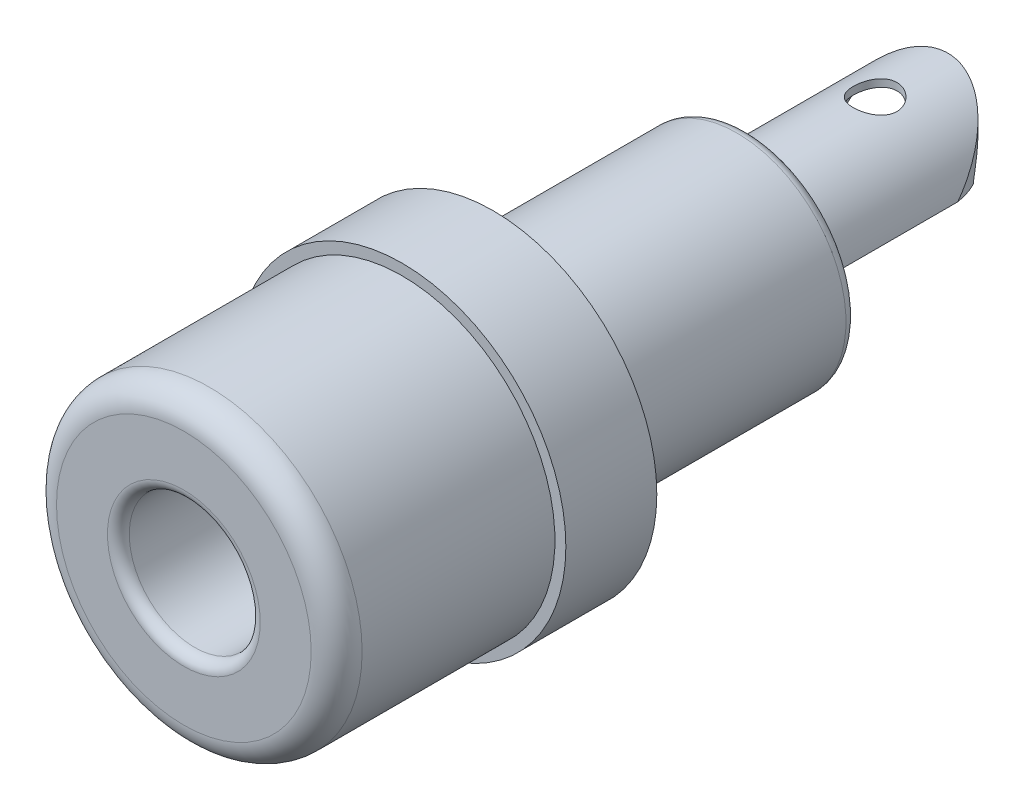
ISO-10303-21;
HEADER;
FILE_DESCRIPTION(('STEP AP214'),'2;1');
FILE_NAME('part.step','',(''),(''),'','','');
FILE_SCHEMA(('AUTOMOTIVE_DESIGN { 1 0 10303 214 1 1 1 1 }'));
ENDSEC;
DATA;
#1=APPLICATION_CONTEXT('core data for automotive mechanical design processes');
#2=APPLICATION_PROTOCOL_DEFINITION('international standard','automotive_design',2000,#1);
#3=PRODUCT_CONTEXT('',#1,'mechanical');
#4=PRODUCT('Part','Part','',(#3));
#5=PRODUCT_RELATED_PRODUCT_CATEGORY('part','',(#4));
#6=PRODUCT_DEFINITION_FORMATION('','',#4);
#7=PRODUCT_DEFINITION_CONTEXT('part definition',#1,'design');
#8=PRODUCT_DEFINITION('design','',#6,#7);
#9=PRODUCT_DEFINITION_SHAPE('','',#8);
#10=(LENGTH_UNIT() NAMED_UNIT(*) SI_UNIT(.MILLI.,.METRE.));
#11=(NAMED_UNIT(*) PLANE_ANGLE_UNIT() SI_UNIT($,.RADIAN.));
#12=(NAMED_UNIT(*) SI_UNIT($,.STERADIAN.) SOLID_ANGLE_UNIT());
#13=UNCERTAINTY_MEASURE_WITH_UNIT(LENGTH_MEASURE(1.E-05),#10,'distance_accuracy_value','');
#14=(GEOMETRIC_REPRESENTATION_CONTEXT(3) GLOBAL_UNCERTAINTY_ASSIGNED_CONTEXT((#13)) GLOBAL_UNIT_ASSIGNED_CONTEXT((#10,
#11,#12)) REPRESENTATION_CONTEXT('',''));
#15=CARTESIAN_POINT('',(0.,0.,0.));
#16=DIRECTION('',(0.,0.,1.));
#17=DIRECTION('',(1.,0.,0.));
#18=AXIS2_PLACEMENT_3D('',#15,#16,#17);
#19=CARTESIAN_POINT('',(0.,0.,6.));
#20=DIRECTION('',(0.,0.,-1.));
#21=DIRECTION('',(-1.,0.,0.));
#22=AXIS2_PLACEMENT_3D('',#19,#20,#21);
#23=CYLINDRICAL_SURFACE('',#22,1.8);
#24=CARTESIAN_POINT('',(0.,0.,5.7));
#25=DIRECTION('',(0.,0.,1.));
#26=DIRECTION('',(1.,0.,0.));
#27=AXIS2_PLACEMENT_3D('',#24,#25,#26);
#28=CIRCLE('',#27,1.8);
#29=CARTESIAN_POINT('',(1.8,0.,5.7));
#30=VERTEX_POINT('',#29);
#31=EDGE_CURVE('E41',#30,#30,#28,.T.);
#32=ORIENTED_EDGE('',*,*,#31,.T.);
#33=EDGE_LOOP('',(#32));
#34=FACE_BOUND('',#33,.T.);
#35=CARTESIAN_POINT('',(0.,1.8,-13.6007348706078));
#36=CARTESIAN_POINT('',(-0.0327380177320338,1.80000009180567,-13.6007350228468));
#37=CARTESIAN_POINT('',(-0.0654751167231297,1.79909861704529,-13.5980467109315));
#38=CARTESIAN_POINT('',(-0.129985056523783,1.79559126121966,-13.5873974053175));
#39=CARTESIAN_POINT('',(-0.161757796871289,1.79298520321283,-13.5794358642384));
#40=CARTESIAN_POINT('',(-0.223399673701066,1.78635184743874,-13.5585433245774));
#41=CARTESIAN_POINT('',(-0.253271895531622,1.78232692638544,-13.5456206331322));
#42=CARTESIAN_POINT('',(-0.310424962083192,1.77326667430373,-13.5152101669048));
#43=CARTESIAN_POINT('',(-0.337705294175215,1.76823114400547,-13.4977214916063));
#44=CARTESIAN_POINT('',(-0.389845005013366,1.75748456665927,-13.4580393876925));
#45=CARTESIAN_POINT('',(-0.414602220179014,1.75175733878739,-13.4357161300513));
#46=CARTESIAN_POINT('',(-0.46009961562122,1.74036188869405,-13.387274577784));
#47=CARTESIAN_POINT('',(-0.480838911293566,1.7346936797258,-13.3611554496514));
#48=CARTESIAN_POINT('',(-0.518294965336828,1.72387999488164,-13.3049438014891));
#49=CARTESIAN_POINT('',(-0.534878914933048,1.71875423572221,-13.2747586267656));
#50=CARTESIAN_POINT('',(-0.562691324326204,1.70985183244355,-13.2118292139356));
#51=CARTESIAN_POINT('',(-0.573921418430458,1.70607477671028,-13.179085760321));
#52=CARTESIAN_POINT('',(-0.590324076904995,1.70046781986259,-13.1131309377075));
#53=CARTESIAN_POINT('',(-0.595688068966016,1.69857657552103,-13.0799725454926));
#54=CARTESIAN_POINT('',(-0.600804674003908,1.69677394067485,-13.0131766180881));
#55=CARTESIAN_POINT('',(-0.60055902096291,1.696861938372,-12.9795392341713));
#56=CARTESIAN_POINT('',(-0.594611942221213,1.6989540898245,-12.9143728923435));
#57=CARTESIAN_POINT('',(-0.589160347899972,1.70087049514499,-12.8828178288569));
#58=CARTESIAN_POINT('',(-0.573363697709875,1.70625994640752,-12.8210988188431));
#59=CARTESIAN_POINT('',(-0.563018055955183,1.7097331787209,-12.7909350393466));
#60=CARTESIAN_POINT('',(-0.537563434836065,1.71790746677097,-12.7322872208531));
#61=CARTESIAN_POINT('',(-0.522380429224341,1.72262739475427,-12.7038380553261));
#62=CARTESIAN_POINT('',(-0.4877334637819,1.73275535145879,-12.6498123256399));
#63=CARTESIAN_POINT('',(-0.468268267418407,1.738163578744,-12.6242365944477));
#64=CARTESIAN_POINT('',(-0.424409599609338,1.74940397500517,-12.5752799117113));
#65=CARTESIAN_POINT('',(-0.399811890045786,1.75524353612871,-12.5520832539023));
#66=CARTESIAN_POINT('',(-0.34700374198204,1.76644163032256,-12.5100961106097));
#67=CARTESIAN_POINT('',(-0.318792957396489,1.7718001172285,-12.4913060477091));
#68=CARTESIAN_POINT('',(-0.25916856782776,1.78150264762667,-12.4585170904667));
#69=CARTESIAN_POINT('',(-0.227725965849802,1.78583610004821,-12.4445675758033));
#70=CARTESIAN_POINT('',(-0.162761450018705,1.79292340286663,-12.4222129662344));
#71=CARTESIAN_POINT('',(-0.129240262892973,1.79567780192928,-12.4138059453537));
#72=CARTESIAN_POINT('',(-0.0626302977175825,1.79920576242864,-12.4031014709944));
#73=CARTESIAN_POINT('',(-0.0295857599189076,1.80006001100238,-12.4005549851041));
#74=CARTESIAN_POINT('',(0.0364650419761412,1.79993341616895,-12.4009344747669));
#75=CARTESIAN_POINT('',(0.0694713115917873,1.79895288251611,-12.4038595265957));
#76=CARTESIAN_POINT('',(0.133511919782555,1.79532014830268,-12.4149020152494));
#77=CARTESIAN_POINT('',(0.164575684100913,1.79271719226737,-12.4228665942375));
#78=CARTESIAN_POINT('',(0.224913575147736,1.7861510809802,-12.4435709372878));
#79=CARTESIAN_POINT('',(0.254187473105135,1.78218775227925,-12.4563113102884));
#80=CARTESIAN_POINT('',(0.310972977835992,1.77317358772456,-12.4865771297123));
#81=CARTESIAN_POINT('',(0.338417975530396,1.76809688853783,-12.5042196265779));
#82=CARTESIAN_POINT('',(0.390038898081241,1.75743152349446,-12.5436513606156));
#83=CARTESIAN_POINT('',(0.414213820676935,1.75184270155133,-12.5654418642259));
#84=CARTESIAN_POINT('',(0.459751504684207,1.74046108789483,-12.6137221212127));
#85=CARTESIAN_POINT('',(0.480936581549093,1.73467056657093,-12.6403804067677));
#86=CARTESIAN_POINT('',(0.51855451339251,1.72379983972189,-12.6969978112905));
#87=CARTESIAN_POINT('',(0.534987328752505,1.71871964011872,-12.7269569577739));
#88=CARTESIAN_POINT('',(0.562558158254016,1.70989435092185,-12.7893386797917));
#89=CARTESIAN_POINT('',(0.573706879318659,1.70614656540379,-12.8217561181535));
#90=CARTESIAN_POINT('',(0.590336800075297,1.7004649943948,-12.8881620606823));
#91=CARTESIAN_POINT('',(0.595820552976746,1.69853039173619,-12.9221498498676));
#92=CARTESIAN_POINT('',(0.600765769482227,1.69678715325043,-12.9888531282157));
#93=CARTESIAN_POINT('',(0.600522154386556,1.69687440206579,-13.0215442747588));
#94=CARTESIAN_POINT('',(0.594745376072927,1.69890761954136,-13.0863939155476));
#95=CARTESIAN_POINT('',(0.589212527675332,1.70085347757531,-13.1185524413795));
#96=CARTESIAN_POINT('',(0.573223087876189,1.70630714567366,-13.1808162684154));
#97=CARTESIAN_POINT('',(0.562862007608928,1.70978458809308,-13.2109489656121));
#98=CARTESIAN_POINT('',(0.537587619456229,1.7178983929526,-13.2690713147691));
#99=CARTESIAN_POINT('',(0.522673301132388,1.72253501259178,-13.2970604893201));
#100=CARTESIAN_POINT('',(0.487956415549949,1.73269697534436,-13.351425072562));
#101=CARTESIAN_POINT('',(0.467968945658719,1.73825226984962,-13.3776767717469));
#102=CARTESIAN_POINT('',(0.423985729881418,1.74950013770272,-13.4265487586382));
#103=CARTESIAN_POINT('',(0.399988850670897,1.75519274947511,-13.4491680160206));
#104=CARTESIAN_POINT('',(0.347544934152404,1.76634018315236,-13.4910215179813));
#105=CARTESIAN_POINT('',(0.318960908099835,1.7717770908073,-13.5100894792584));
#106=CARTESIAN_POINT('',(0.258814414443977,1.78155594703591,-13.5431291279182));
#107=CARTESIAN_POINT('',(0.227252710879409,1.78589817544764,-13.557102118161));
#108=CARTESIAN_POINT('',(0.163496188320585,1.79283309041119,-13.578967850101));
#109=CARTESIAN_POINT('',(0.131392654605845,1.79549527453512,-13.5871043503658));
#110=CARTESIAN_POINT('',(0.0661922496061482,1.79907844238535,-13.5979870390141));
#111=CARTESIAN_POINT('',(0.0330956553412479,1.79999990719143,-13.6007347167057));
#112=CARTESIAN_POINT('',(0.,1.8,-13.6007348706078));
#113=B_SPLINE_CURVE_WITH_KNOTS('',3,(#35,#36,#37,#38,#39,#40,#41,#42,#43,#44,#45,#46,#47,#48,
#49,#50,#51,#52,#53,#54,#55,#56,#57,#58,#59,#60,#61,#62,#63,#64,#65,#66,#67,#68,#69,#70,#71,#72,
#73,#74,#75,#76,#77,#78,#79,#80,#81,#82,#83,#84,#85,#86,#87,#88,#89,#90,#91,#92,#93,#94,#95,#96,
#97,#98,#99,#100,#101,#102,#103,#104,#105,#106,#107,#108,#109,#110,#111,#112),.UNSPECIFIED.,.T.,
.F.,(4,2,2,2,2,2,2,2,2,2,2,2,2,2,2,2,2,2,2,2,2,2,2,2,2,2,2,2,2,2,2,2,2,2,2,2,2,2,4),(0.,
0.0980922636156061,0.196194711160512,0.294133603722163,0.392091826679459,0.493108105696535,
0.59414659972518,0.698090308940824,0.802002268156999,0.902411554425504,1.00278980387301,
1.09858095925578,1.19438358508099,1.29172902687889,1.38910261529734,1.4915598348163,
1.59402687574781,1.69751043385025,1.80095801321135,1.89992149899912,1.99886827893316,
2.09494894781738,2.19104187165272,2.28966239901052,2.38831308487945,2.49144613723261,
2.59458004935808,2.6975040828946,2.80038170815317,2.89797399628781,2.99556047599521,
3.09129352236946,3.18704782894283,3.28698040003779,3.38694126662963,3.49079796489756,
3.5946280868017,3.69381935012984,3.7929831961158),.UNSPECIFIED.);
#114=CARTESIAN_POINT('',(0.,1.8,-13.6007348706078));
#115=VERTEX_POINT('',#114);
#116=EDGE_CURVE('E121',#115,#115,#113,.T.);
#117=ORIENTED_EDGE('',*,*,#116,.T.);
#118=EDGE_LOOP('',(#117));
#119=FACE_BOUND('',#118,.T.);
#120=DIRECTION('',(0.,0.,1.));
#121=VECTOR('',#120,1.);
#122=CARTESIAN_POINT('',(-1.77482393492988,0.3,-40.3046486500062));
#123=LINE('',#122,#121);
#124=CARTESIAN_POINT('',(-1.77482393492988,0.299999999999998,-13.9210940709223));
#125=VERTEX_POINT('',#124);
#126=CARTESIAN_POINT('',(-1.77482393492988,0.3,-9.5));
#127=VERTEX_POINT('',#126);
#128=EDGE_CURVE('E92',#125,#127,#123,.T.);
#129=ORIENTED_EDGE('',*,*,#128,.F.);
#130=CARTESIAN_POINT('',(-1.8,0.,-13.8708274275255));
#131=CARTESIAN_POINT('',(-1.80000540923821,0.0273212835889739,-13.8708046515745));
#132=CARTESIAN_POINT('',(-1.79937773064341,0.0546182889958019,-13.8721154858209));
#133=CARTESIAN_POINT('',(-1.79690877179539,0.108854711485443,-13.8772008154702));
#134=CARTESIAN_POINT('',(-1.79507077819749,0.135794895985899,-13.8809686385602));
#135=CARTESIAN_POINT('',(-1.78790475520837,0.214845245646857,-13.8954824661366));
#136=CARTESIAN_POINT('',(-1.78092030388619,0.266219131823027,-13.9094543854984));
#137=CARTESIAN_POINT('',(-1.75872274013309,0.390725371269543,-13.9519195362688));
#138=CARTESIAN_POINT('',(-1.7411493276756,0.462073713965778,-13.9841765357544));
#139=CARTESIAN_POINT('',(-1.69874521910181,0.599588329947943,-14.0557657390422));
#140=CARTESIAN_POINT('',(-1.67383505602685,0.665687228778102,-14.0951734995342));
#141=CARTESIAN_POINT('',(-1.62151254890367,0.783723503020899,-14.1710208864447));
#142=CARTESIAN_POINT('',(-1.59499154911741,0.836322090169787,-14.2070581717374));
#143=CARTESIAN_POINT('',(-1.53720866191813,0.938310784460617,-14.2798825665153));
#144=CARTESIAN_POINT('',(-1.5059438359789,0.987698875609969,-14.316670128442));
#145=CARTESIAN_POINT('',(-1.40521265571992,1.13092236798577,-14.426298860448));
#146=CARTESIAN_POINT('',(-1.32860369837563,1.22027829571291,-14.4987244765749));
#147=CARTESIAN_POINT('',(-1.17681137326886,1.36501569800337,-14.6191259314979));
#148=CARTESIAN_POINT('',(-1.1057779172675,1.42338376677199,-14.6687745882009));
#149=CARTESIAN_POINT('',(-0.952407933008528,1.53023622824735,-14.7608309924895));
#150=CARTESIAN_POINT('',(-0.870087075158914,1.57873409590929,-14.8032485989894));
#151=CARTESIAN_POINT('',(-0.712151901768292,1.65497642563914,-14.8704288928505));
#152=CARTESIAN_POINT('',(-0.638388108483012,1.68492563549023,-14.8970225322606));
#153=CARTESIAN_POINT('',(-0.48522778528316,1.73523332905439,-14.9418593023828));
#154=CARTESIAN_POINT('',(-0.405834996655984,1.75559811551519,-14.9601079205834));
#155=CARTESIAN_POINT('',(-0.242887864108498,1.78546935266674,-14.9869166665395));
#156=CARTESIAN_POINT('',(-0.159311368566592,1.79490978027358,-14.9954178815297));
#157=CARTESIAN_POINT('',(0.00873761011171364,1.80193988970709,-15.0017460145548));
#158=CARTESIAN_POINT('',(0.0932097967957123,1.79953337750131,-14.999576360731));
#159=CARTESIAN_POINT('',(0.251893967541528,1.78389613132067,-14.9855111976086));
#160=CARTESIAN_POINT('',(0.326304452543621,1.77174154921254,-14.9745827093039));
#161=CARTESIAN_POINT('',(0.471551651141702,1.73873215661482,-14.9450077383162));
#162=CARTESIAN_POINT('',(0.54238757816978,1.71787544053079,-14.9263595651826));
#163=CARTESIAN_POINT('',(0.682910213844337,1.66718907043137,-14.8812769536451));
#164=CARTESIAN_POINT('',(0.752320129264993,1.63692951408235,-14.8544711259141));
#165=CARTESIAN_POINT('',(0.884815246712993,1.56928129758766,-14.7950161587097));
#166=CARTESIAN_POINT('',(0.947898432427714,1.53189037564087,-14.7623651655717));
#167=CARTESIAN_POINT('',(1.09884875915407,1.42991083696128,-14.6742741574571));
#168=CARTESIAN_POINT('',(1.18231688882613,1.3613560851102,-14.6158757973679));
#169=CARTESIAN_POINT('',(1.3340171856506,1.21314644697905,-14.4930538651354));
#170=CARTESIAN_POINT('',(1.40218870286604,1.13344933940626,-14.4286076968813));
#171=CARTESIAN_POINT('',(1.49384683396911,1.00560940048153,-14.3302323305205));
#172=CARTESIAN_POINT('',(1.52291704087311,0.961022066100188,-14.2967405271588));
#173=CARTESIAN_POINT('',(1.57712212314051,0.869212121970928,-14.23019974892));
#174=CARTESIAN_POINT('',(1.6022585838982,0.821990584332634,-14.1971506005783));
#175=CARTESIAN_POINT('',(1.64849531001723,0.724812289669821,-14.1325896082659));
#176=CARTESIAN_POINT('',(1.66960625173658,0.674863232761343,-14.1010738677859));
#177=CARTESIAN_POINT('',(1.70766662863583,0.57174332074305,-14.0410201136218));
#178=CARTESIAN_POINT('',(1.72462238093073,0.518577511439559,-14.0124776181929));
#179=CARTESIAN_POINT('',(1.75227734228499,0.414809375330063,-13.963688084292));
#180=CARTESIAN_POINT('',(1.76347253075727,0.364618316639512,-13.942864017903));
#181=CARTESIAN_POINT('',(1.78168196381915,0.26138481756263,-13.9079633842278));
#182=CARTESIAN_POINT('',(1.7887205867006,0.208361032931755,-13.8938475703145));
#183=CARTESIAN_POINT('',(1.79555291088374,0.128992257415699,-13.8799818367588));
#184=CARTESIAN_POINT('',(1.79720907313568,0.103428270666778,-13.8765836690024));
#185=CARTESIAN_POINT('',(1.79943765407354,0.0519177083159683,-13.8719912511546));
#186=CARTESIAN_POINT('',(1.80000411576696,0.0259698067873122,-13.8708091161918));
#187=CARTESIAN_POINT('',(1.8,0.,-13.8708274275255));
#188=B_SPLINE_CURVE_WITH_KNOTS('',3,(#130,#131,#132,#133,#134,#135,#136,#137,#138,#139,#140,
#141,#142,#143,#144,#145,#146,#147,#148,#149,#150,#151,#152,#153,#154,#155,#156,#157,#158,#159,
#160,#161,#162,#163,#164,#165,#166,#167,#168,#169,#170,#171,#172,#173,#174,#175,#176,#177,#178,
#179,#180,#181,#182,#183,#184,#185,#186,#187),.UNSPECIFIED.,.F.,.F.,(4,2,2,2,2,2,2,2,2,2,2,2,2,
2,2,2,2,2,2,2,2,2,2,2,2,2,2,2,4),(0.,0.0818841494021474,0.163546851289647,0.323824679561786,
0.563255515992799,0.805381577202844,1.01228021967863,1.21930755111762,1.63159055833515,
1.94400425203985,2.25598852944884,2.50679257630735,2.7574314623672,3.00957734068643,
3.26164221948919,3.48917734766555,3.71676232768651,3.95684684506776,4.1970076352422,
4.56338762599947,4.9311955793092,5.11971555990609,5.30815936565666,5.49609621494709,
5.68374554707032,5.8497580095361,6.0147868804176,6.09220322189024,6.1700415806469),.UNSPECIFIED.);
#189=CARTESIAN_POINT('',(1.77482393492988,0.3,-13.9210940709223));
#190=VERTEX_POINT('',#189);
#191=EDGE_CURVE('E48',#125,#190,#188,.T.);
#192=ORIENTED_EDGE('',*,*,#191,.T.);
#193=DIRECTION('',(0.,0.,1.));
#194=VECTOR('',#193,1.);
#195=CARTESIAN_POINT('',(1.77482393492988,0.3,-40.3046486500062));
#196=LINE('',#195,#194);
#197=CARTESIAN_POINT('',(1.77482393492988,0.3,-9.5));
#198=VERTEX_POINT('',#197);
#199=EDGE_CURVE('E84',#190,#198,#196,.T.);
#200=ORIENTED_EDGE('',*,*,#199,.T.);
#201=CARTESIAN_POINT('',(0.,0.,-9.5));
#202=DIRECTION('',(0.,0.,-1.));
#203=DIRECTION('',(-1.,0.,0.));
#204=AXIS2_PLACEMENT_3D('',#201,#202,#203);
#205=CIRCLE('',#204,1.8);
#206=EDGE_CURVE('E104',#198,#127,#205,.T.);
#207=ORIENTED_EDGE('',*,*,#206,.T.);
#208=EDGE_LOOP('',(#129,#192,#200,#207));
#209=FACE_BOUND('',#208,.T.);
#210=ADVANCED_FACE('F33',(#34,#119,#209),#23,.F.);
#211=CARTESIAN_POINT('',(0.,0.,-40.3046486500062));
#212=DIRECTION('',(0.,0.,1.));
#213=DIRECTION('',(1.,0.,0.));
#214=AXIS2_PLACEMENT_3D('',#211,#212,#213);
#215=CYLINDRICAL_SURFACE('',#214,2.);
#216=CARTESIAN_POINT('',(0.,2.,-13.6007348706078));
#217=CARTESIAN_POINT('',(-0.0329154451013199,1.99999971700221,-13.6007344716138));
#218=CARTESIAN_POINT('',(-0.0658349273406117,1.99917966277583,-13.5980173251582));
#219=CARTESIAN_POINT('',(-0.130715250121952,1.99598842237475,-13.5872463289189));
#220=CARTESIAN_POINT('',(-0.162675801764567,1.99361677355871,-13.5791908873985));
#221=CARTESIAN_POINT('',(-0.22469308310181,1.9875822100074,-13.5580364638437));
#222=CARTESIAN_POINT('',(-0.25475254575815,1.98392120100191,-13.5449449227602));
#223=CARTESIAN_POINT('',(-0.312249672421251,1.97568843695037,-13.5141204333855));
#224=CARTESIAN_POINT('',(-0.339686986987863,1.97111656076748,-13.4963868676496));
#225=CARTESIAN_POINT('',(-0.391948718873501,1.9614029487719,-13.4562452676187));
#226=CARTESIAN_POINT('',(-0.416687228497751,1.9562495346312,-13.4337282202533));
#227=CARTESIAN_POINT('',(-0.462099683693278,1.94602333683871,-13.3848911786438));
#228=CARTESIAN_POINT('',(-0.482772945309703,1.94095056688659,-13.3585705457582));
#229=CARTESIAN_POINT('',(-0.51992015089489,1.93133645598676,-13.3021465693923));
#230=CARTESIAN_POINT('',(-0.53628923608908,1.92680962669952,-13.2719714862099));
#231=CARTESIAN_POINT('',(-0.563685579098815,1.91897448153211,-13.2091391689173));
#232=CARTESIAN_POINT('',(-0.574714119679047,1.91566587308889,-13.1764825330427));
#233=CARTESIAN_POINT('',(-0.590806534730252,1.91076348351385,-13.1105787641545));
#234=CARTESIAN_POINT('',(-0.596028784940188,1.90912427788711,-13.0773737730504));
#235=CARTESIAN_POINT('',(-0.600854922460317,1.90761115958514,-13.0105216081067));
#236=CARTESIAN_POINT('',(-0.600460171044287,1.90773681919679,-12.976874543378));
#237=CARTESIAN_POINT('',(-0.594187908798803,1.90969897612233,-12.9113813071654));
#238=CARTESIAN_POINT('',(-0.588508821050622,1.91147355435668,-12.8795139704632));
#239=CARTESIAN_POINT('',(-0.572149681708342,1.91643342495439,-12.8172069560981));
#240=CARTESIAN_POINT('',(-0.561469136566595,1.91961885654016,-12.786767419658));
#241=CARTESIAN_POINT('',(-0.535264106614693,1.92709093228899,-12.7276947307436));
#242=CARTESIAN_POINT('',(-0.519675267738561,1.93139206446088,-12.6990920370257));
#243=CARTESIAN_POINT('',(-0.484140890354741,1.94060394800318,-12.6448420618037));
#244=CARTESIAN_POINT('',(-0.464194296010355,1.94551484698876,-12.6191954988423));
#245=CARTESIAN_POINT('',(-0.419525163062182,1.95564404519092,-12.570460394303));
#246=CARTESIAN_POINT('',(-0.394637962986787,1.96086661724177,-12.5475234049959));
#247=CARTESIAN_POINT('',(-0.341305303725586,1.97084897625326,-12.5061132769821));
#248=CARTESIAN_POINT('',(-0.312859620744354,1.9756087340737,-12.487640419242));
#249=CARTESIAN_POINT('',(-0.252942015337119,1.98417264027782,-12.4555909016219));
#250=CARTESIAN_POINT('',(-0.221451099899179,1.98797017467324,-12.4420478641078));
#251=CARTESIAN_POINT('',(-0.156498166241407,1.9941340873289,-12.4204950345679));
#252=CARTESIAN_POINT('',(-0.123036700635833,1.996500864748,-12.4124836991948));
#253=CARTESIAN_POINT('',(-0.056380897067333,1.99947345857415,-12.402473999448));
#254=CARTESIAN_POINT('',(-0.0232200390404748,2.00013940167117,-12.4002702362871));
#255=CARTESIAN_POINT('',(0.0429998423293526,1.99981169296703,-12.4013625328926));
#256=CARTESIAN_POINT('',(0.0760588786763107,1.99881826271098,-12.4046578584684));
#257=CARTESIAN_POINT('',(0.14036144212388,1.99532278794869,-12.4164887150524));
#258=CARTESIAN_POINT('',(0.171629109045672,1.99285531919782,-12.4249042256401));
#259=CARTESIAN_POINT('',(0.232301855581804,1.98669739136598,-12.4465921637191));
#260=CARTESIAN_POINT('',(0.261706710810216,1.98300678528377,-12.4598651750229));
#261=CARTESIAN_POINT('',(0.318574875784436,1.97467861740588,-12.4912361368003));
#262=CARTESIAN_POINT('',(0.34597753047993,1.97002112332088,-12.5094386069871));
#263=CARTESIAN_POINT('',(0.397409323191995,1.96029387505509,-12.5500247722287));
#264=CARTESIAN_POINT('',(0.421437612942136,1.95522401771617,-12.5724095153622));
#265=CARTESIAN_POINT('',(0.466342978204351,1.94501268748499,-12.6216897939562));
#266=CARTESIAN_POINT('',(0.487073924926942,1.93987530016511,-12.6487196209189));
#267=CARTESIAN_POINT('',(0.523715980287685,1.93030606092181,-12.7059860462107));
#268=CARTESIAN_POINT('',(0.539627215314416,1.92587419049889,-12.7362225604219));
#269=CARTESIAN_POINT('',(0.566069388510893,1.91826875857973,-12.7989478671159));
#270=CARTESIAN_POINT('',(0.576625387759088,1.91508935181965,-12.8314253452504));
#271=CARTESIAN_POINT('',(0.592086923271644,1.91036637789379,-12.89781005821));
#272=CARTESIAN_POINT('',(0.596994395917994,1.90882225014947,-12.9317167989323));
#273=CARTESIAN_POINT('',(0.600887937937676,1.90759988987286,-12.9984794779526));
#274=CARTESIAN_POINT('',(0.600112221233274,1.90784658974116,-13.0313203310133));
#275=CARTESIAN_POINT('',(0.593230021779939,1.90999760518303,-13.0963805119584));
#276=CARTESIAN_POINT('',(0.587123752499047,1.91190185437816,-13.1285998646787));
#277=CARTESIAN_POINT('',(0.569907555216364,1.91710305467369,-13.1911130302645));
#278=CARTESIAN_POINT('',(0.558860702028225,1.92038241818175,-13.2214257855524));
#279=CARTESIAN_POINT('',(0.532126028484566,1.92796111563865,-13.279791846135));
#280=CARTESIAN_POINT('',(0.516437319851519,1.93226064477782,-13.3078447176641));
#281=CARTESIAN_POINT('',(0.480195055220275,1.94159070570274,-13.3620001172186));
#282=CARTESIAN_POINT('',(0.459485104371972,1.94664216065503,-13.3879943751119));
#283=CARTESIAN_POINT('',(0.414069738519131,1.95680528180026,-13.4362158699309));
#284=CARTESIAN_POINT('',(0.389363286853801,1.96191696329566,-13.4584421263949));
#285=CARTESIAN_POINT('',(0.335786304873297,1.97180374628255,-13.4991442355258));
#286=CARTESIAN_POINT('',(0.306815154316242,1.97656463906268,-13.51749144935));
#287=CARTESIAN_POINT('',(0.246056549593411,1.98504272182326,-13.5490289385694));
#288=CARTESIAN_POINT('',(0.214270421199581,1.98876039972427,-13.5622216259176));
#289=CARTESIAN_POINT('',(0.152303085062112,1.9944086998772,-13.5818929808689));
#290=CARTESIAN_POINT('',(0.122314784781694,1.99648810952427,-13.5889395397611));
#291=CARTESIAN_POINT('',(0.0615520780923121,1.99928377797797,-13.5983602807044));
#292=CARTESIAN_POINT('',(0.030777803943256,2.00000026461896,-13.6007352436897));
#293=CARTESIAN_POINT('',(0.,2.,-13.6007348706078));
#294=B_SPLINE_CURVE_WITH_KNOTS('',3,(#216,#217,#218,#219,#220,#221,#222,#223,#224,#225,#226,
#227,#228,#229,#230,#231,#232,#233,#234,#235,#236,#237,#238,#239,#240,#241,#242,#243,#244,#245,
#246,#247,#248,#249,#250,#251,#252,#253,#254,#255,#256,#257,#258,#259,#260,#261,#262,#263,#264,
#265,#266,#267,#268,#269,#270,#271,#272,#273,#274,#275,#276,#277,#278,#279,#280,#281,#282,#283,
#284,#285,#286,#287,#288,#289,#290,#291,#292,#293),.UNSPECIFIED.,.T.,.F.,(4,2,2,2,2,2,2,2,2,2,2,
2,2,2,2,2,2,2,2,2,2,2,2,2,2,2,2,2,2,2,2,2,2,2,2,2,2,2,4),(0.,0.0986332814450439,
0.197295985938399,0.295813470520349,0.39434406576508,0.495422411792764,0.59651774915453,
0.699885924016437,0.803229258172892,0.903678757411505,1.00410391324614,1.10090406676049,
1.19771377460179,1.29584970575826,1.39400944060401,1.49626841616245,1.59853382609407,
1.70148418749654,1.80440581408501,1.90363523772396,2.00285141417109,2.09982698669909,
2.1968142183447,2.29604522278142,2.39530112797055,2.49816160126106,2.60101937698051,
2.7033912597652,2.80572803779072,2.90380062181736,3.00186927859599,3.09872016156048,
3.19558959016202,3.29598770266931,3.3964118995396,3.49977198457628,3.60308364633053,
3.69532676767143,3.78755446774509),.UNSPECIFIED.);
#295=CARTESIAN_POINT('',(0.,2.,-13.6007348706078));
#296=VERTEX_POINT('',#295);
#297=EDGE_CURVE('E80',#296,#296,#294,.T.);
#298=ORIENTED_EDGE('',*,*,#297,.F.);
#299=EDGE_LOOP('',(#298));
#300=FACE_BOUND('',#299,.T.);
#301=CARTESIAN_POINT('',(-1.99926512939221,0.0542120133950132,-13.0007348706078));
#302=CARTESIAN_POINT('',(-1.99926544229567,0.0541892752252256,-13.0045705003581));
#303=CARTESIAN_POINT('',(-1.99925414443223,0.0546179890129462,-13.0083667297564));
#304=CARTESIAN_POINT('',(-1.99921207426811,0.0561424826539032,-13.015733887174));
#305=CARTESIAN_POINT('',(-1.99918177584472,0.0572220065585727,-13.0193080357622));
#306=CARTESIAN_POINT('',(-1.99905779304332,0.0614451759181349,-13.0305790637227));
#307=CARTESIAN_POINT('',(-1.99893205108814,0.0654908554195775,-13.0379111464521));
#308=CARTESIAN_POINT('',(-1.99861711317244,0.0745118522539095,-13.0521299982837));
#309=CARTESIAN_POINT('',(-1.99842654790211,0.0795061062210708,-13.0590029654449));
#310=CARTESIAN_POINT('',(-1.99723172576251,0.107601531872094,-13.0958423146994));
#311=CARTESIAN_POINT('',(-1.99569213131996,0.133606957336773,-13.1234962344913));
#312=CARTESIAN_POINT('',(-1.99155664959128,0.185526806812603,-13.1781270876444));
#313=CARTESIAN_POINT('',(-1.98897061838641,0.21143986412281,-13.2051079098726));
#314=CARTESIAN_POINT('',(-1.97957236361627,0.289883111657074,-13.285949946783));
#315=CARTESIAN_POINT('',(-1.97113327640812,0.342770880677535,-13.3393386580281));
#316=CARTESIAN_POINT('',(-1.94988588670936,0.448183454890475,-13.4456187513169));
#317=CARTESIAN_POINT('',(-1.93707493218384,0.500708019980446,-13.4985098114198));
#318=CARTESIAN_POINT('',(-1.90693331075533,0.605456792409913,-13.6037982377075));
#319=CARTESIAN_POINT('',(-1.88958306463922,0.657678671585724,-13.6561924206078));
#320=CARTESIAN_POINT('',(-1.85028582702617,0.761257790887164,-13.7600652618009));
#321=CARTESIAN_POINT('',(-1.82833964008914,0.812615180651434,-13.8115440786276));
#322=CARTESIAN_POINT('',(-1.75523874932515,0.965357104978325,-13.9645937787004));
#323=CARTESIAN_POINT('',(-1.6969021664684,1.0651235348985,-14.064489081262));
#324=CARTESIAN_POINT('',(-1.55981747921933,1.257327157592,-14.2568990776492));
#325=CARTESIAN_POINT('',(-1.48110906441173,1.34977815043483,-14.3494276704039));
#326=CARTESIAN_POINT('',(-1.32468777751634,1.5012783096384,-14.5010361999037));
#327=CARTESIAN_POINT('',(-1.25185050450801,1.56282928988267,-14.5626248482409));
#328=CARTESIAN_POINT('',(-1.09363993020102,1.67733655152659,-14.6771961568561));
#329=CARTESIAN_POINT('',(-1.00828128036743,1.73030272771215,-14.7301887249751));
#330=CARTESIAN_POINT('',(-0.84281150342767,1.81565785513585,-14.8155835923759));
#331=CARTESIAN_POINT('',(-0.764774331158803,1.8500442188765,-14.849984828585));
#332=CARTESIAN_POINT('',(-0.601726145177751,1.90930099941634,-14.9092662661246));
#333=CARTESIAN_POINT('',(-0.516719712725512,1.93417760752301,-14.9341526620745));
#334=CARTESIAN_POINT('',(-0.340994281035888,1.9727811844718,-14.9727711158483));
#335=CARTESIAN_POINT('',(-0.25023698195819,1.98642251506602,-14.986417499373));
#336=CARTESIAN_POINT('',(-0.0667057154365254,2.00100113286654,-15.0010015112697));
#337=CARTESIAN_POINT('',(0.02606700724611,2.00194605004895,-15.0019467724476));
#338=CARTESIAN_POINT('',(0.198716901916874,1.99174836280759,-14.9917453193297));
#339=CARTESIAN_POINT('',(0.278777778588639,1.98207690027572,-14.9820702890579));
#340=CARTESIAN_POINT('',(0.435563980591769,1.95362073188233,-14.9536033210733));
#341=CARTESIAN_POINT('',(0.512288849726159,1.93483478386466,-14.9348101407049));
#342=CARTESIAN_POINT('',(0.662958597860155,1.88861901524004,-14.8885757668672));
#343=CARTESIAN_POINT('',(0.736756591712029,1.86095250916426,-14.8608977730439));
#344=CARTESIAN_POINT('',(0.878095554203182,1.79859016125622,-14.7985081058378));
#345=CARTESIAN_POINT('',(0.945633658956009,1.76389112496321,-14.7637932360191));
#346=CARTESIAN_POINT('',(1.10792901768266,1.66895307752059,-14.6688080205187));
#347=CARTESIAN_POINT('',(1.19823445898219,1.60490123237017,-14.6047210702999));
#348=CARTESIAN_POINT('',(1.36323401466395,1.46737471716391,-14.4671108253015));
#349=CARTESIAN_POINT('',(1.43788334108143,1.39387395832027,-14.3935614038499));
#350=CARTESIAN_POINT('',(1.5980761374004,1.21083297468346,-14.2103565434719));
#351=CARTESIAN_POINT('',(1.67675639337115,1.09830892481442,-14.0976988747925));
#352=CARTESIAN_POINT('',(1.8076469200228,0.866107930427504,-13.8651932467724));
#353=CARTESIAN_POINT('',(1.85987270077393,0.746435223237662,-13.7453495467562));
#354=CARTESIAN_POINT('',(1.92750113254205,0.540932374490924,-13.5389412145096));
#355=CARTESIAN_POINT('',(1.94928751785189,0.456002146178685,-13.4534657830305));
#356=CARTESIAN_POINT('',(1.97508798794588,0.318943888965315,-13.3152594120772));
#357=CARTESIAN_POINT('',(1.98272330589272,0.267135131075478,-13.2629559576691));
#358=CARTESIAN_POINT('',(1.99141536388671,0.187460017592109,-13.1801641246712));
#359=CARTESIAN_POINT('',(1.99388862258429,0.159066017176054,-13.1501771497898));
#360=CARTESIAN_POINT('',(1.99715936912644,0.108537348286812,-13.0958214309994));
#361=CARTESIAN_POINT('',(1.9982031433701,0.0863725803821466,-13.0716347590509));
#362=CARTESIAN_POINT('',(1.99888435110879,0.0668552491869586,-13.039932108776));
#363=CARTESIAN_POINT('',(1.99896114836322,0.0644923746956762,-13.0358458696786));
#364=CARTESIAN_POINT('',(1.99909134055064,0.0603127005753554,-13.0274342228528));
#365=CARTESIAN_POINT('',(1.99914494494175,0.0584910620376696,-13.0231113707305));
#366=CARTESIAN_POINT('',(1.9992105792376,0.0561962622495874,-13.0157753788295));
#367=CARTESIAN_POINT('',(1.99923061510635,0.0554739246464434,-13.0128433535779));
#368=CARTESIAN_POINT('',(1.99925807771314,0.0544722819124151,-13.0068585723416));
#369=CARTESIAN_POINT('',(1.99926529757774,0.0542002501557624,-13.0038046352673));
#370=CARTESIAN_POINT('',(1.99926512939221,0.0542120133950019,-13.0007348706078));
#371=B_SPLINE_CURVE_WITH_KNOTS('',3,(#301,#302,#303,#304,#305,#306,#307,#308,#309,#310,#311,
#312,#313,#314,#315,#316,#317,#318,#319,#320,#321,#322,#323,#324,#325,#326,#327,#328,#329,#330,
#331,#332,#333,#334,#335,#336,#337,#338,#339,#340,#341,#342,#343,#344,#345,#346,#347,#348,#349,
#350,#351,#352,#353,#354,#355,#356,#357,#358,#359,#360,#361,#362,#363,#364,#365,#366,#367,#368,
#369,#370),.UNSPECIFIED.,.F.,.F.,(4,2,2,2,2,2,2,2,2,2,2,2,2,2,2,2,2,2,2,2,2,2,2,2,2,2,2,2,2,2,2,
2,2,2,4),(0.,0.011421081483718,0.0225680665810574,0.0474933860922513,0.0729817905538988,
0.186592587515057,0.299157340184762,0.52581278171619,0.752605960684351,0.980393967686947,
1.20814213167652,1.66487620815461,2.12072706046602,2.46020271450563,2.79928426516999,
3.0740709686374,3.3486784668466,3.62536021526758,3.9018756829016,4.14441071387,4.38697880770744,
4.63663959900825,4.88641405157802,5.26804098112271,5.65074518466557,6.18072939379308,
6.71040251626168,7.07732514853198,7.2990473853576,7.42344967680965,7.52103990134877,
7.53518210291119,7.5491937737039,7.55822116630103,7.56739299594511),.UNSPECIFIED.);
#372=CARTESIAN_POINT('',(-1.97737199332852,0.299999999999998,-13.2957959788611));
#373=VERTEX_POINT('',#372);
#374=CARTESIAN_POINT('',(1.97737199332852,0.300000000000001,-13.2957959788611));
#375=VERTEX_POINT('',#374);
#376=EDGE_CURVE('E74',#373,#375,#371,.T.);
#377=ORIENTED_EDGE('',*,*,#376,.F.);
#378=DIRECTION('',(0.,0.,1.));
#379=VECTOR('',#378,1.);
#380=CARTESIAN_POINT('',(-1.97737199332852,0.3,-40.3046486500062));
#381=LINE('',#380,#379);
#382=CARTESIAN_POINT('',(-1.97737199332852,0.3,-9.5));
#383=VERTEX_POINT('',#382);
#384=EDGE_CURVE('E90',#373,#383,#381,.T.);
#385=ORIENTED_EDGE('',*,*,#384,.T.);
#386=CARTESIAN_POINT('',(0.,0.,-9.5));
#387=DIRECTION('',(0.,0.,-1.));
#388=DIRECTION('',(-1.,0.,0.));
#389=AXIS2_PLACEMENT_3D('',#386,#387,#388);
#390=CIRCLE('',#389,2.);
#391=CARTESIAN_POINT('',(1.97737199332852,0.3,-9.5));
#392=VERTEX_POINT('',#391);
#393=EDGE_CURVE('E89',#383,#392,#390,.T.);
#394=ORIENTED_EDGE('',*,*,#393,.T.);
#395=DIRECTION('',(0.,0.,1.));
#396=VECTOR('',#395,1.);
#397=CARTESIAN_POINT('',(1.97737199332852,0.3,-40.3046486500062));
#398=LINE('',#397,#396);
#399=EDGE_CURVE('E56',#375,#392,#398,.T.);
#400=ORIENTED_EDGE('',*,*,#399,.F.);
#401=EDGE_LOOP('',(#377,#385,#394,#400));
#402=FACE_BOUND('',#401,.T.);
#403=ADVANCED_FACE('F87',(#300,#402),#215,.T.);
#404=CARTESIAN_POINT('',(1.97737199332852,0.3,-40.3046486500062));
#405=DIRECTION('',(0.,1.,0.));
#406=DIRECTION('',(0.,0.,1.));
#407=AXIS2_PLACEMENT_3D('',#404,#405,#406);
#408=PLANE('',#407);
#409=CARTESIAN_POINT('',(0.,0.299999999999998,-13.0007348706078));
#410=DIRECTION('',(0.,1.,0.));
#411=DIRECTION('',(0.,0.,1.));
#412=AXIS2_PLACEMENT_3D('',#409,#410,#411);
#413=CIRCLE('',#412,1.99926512939221);
#414=EDGE_CURVE('E76',#375,#190,#413,.T.);
#415=ORIENTED_EDGE('',*,*,#414,.F.);
#416=ORIENTED_EDGE('',*,*,#399,.T.);
#417=DIRECTION('',(-1.,0.,0.));
#418=VECTOR('',#417,1.);
#419=CARTESIAN_POINT('',(1.97737199332852,0.3,-9.5));
#420=LINE('',#419,#418);
#421=EDGE_CURVE('E94',#392,#198,#420,.T.);
#422=ORIENTED_EDGE('',*,*,#421,.T.);
#423=ORIENTED_EDGE('',*,*,#199,.F.);
#424=EDGE_LOOP('',(#415,#416,#422,#423));
#425=FACE_BOUND('',#424,.T.);
#426=ADVANCED_FACE('F83',(#425),#408,.F.);
#427=CARTESIAN_POINT('',(-1.77482393492988,0.3,-40.3046486500062));
#428=DIRECTION('',(0.,1.,0.));
#429=DIRECTION('',(0.,0.,1.));
#430=AXIS2_PLACEMENT_3D('',#427,#428,#429);
#431=PLANE('',#430);
#432=CARTESIAN_POINT('',(0.,0.299999999999998,-13.0007348706078));
#433=DIRECTION('',(0.,1.,0.));
#434=DIRECTION('',(0.,0.,1.));
#435=AXIS2_PLACEMENT_3D('',#432,#433,#434);
#436=CIRCLE('',#435,1.99926512939221);
#437=EDGE_CURVE('E77',#125,#373,#436,.T.);
#438=ORIENTED_EDGE('',*,*,#437,.F.);
#439=ORIENTED_EDGE('',*,*,#128,.T.);
#440=DIRECTION('',(-1.,0.,0.));
#441=VECTOR('',#440,1.);
#442=CARTESIAN_POINT('',(-1.77482393492988,0.3,-9.5));
#443=LINE('',#442,#441);
#444=EDGE_CURVE('E118',#127,#383,#443,.T.);
#445=ORIENTED_EDGE('',*,*,#444,.T.);
#446=ORIENTED_EDGE('',*,*,#384,.F.);
#447=EDGE_LOOP('',(#438,#439,#445,#446));
#448=FACE_BOUND('',#447,.T.);
#449=ADVANCED_FACE('F196',(#448),#431,.F.);
#450=CARTESIAN_POINT('',(0.,0.,-2.5));
#451=DIRECTION('',(0.,0.,-1.));
#452=DIRECTION('',(-1.,0.,0.));
#453=AXIS2_PLACEMENT_3D('',#450,#451,#452);
#454=PLANE('',#453);
#455=CARTESIAN_POINT('',(0.,0.,-2.5));
#456=DIRECTION('',(0.,0.,-1.));
#457=DIRECTION('',(-1.,0.,0.));
#458=AXIS2_PLACEMENT_3D('',#455,#456,#457);
#459=CIRCLE('',#458,4.5);
#460=CARTESIAN_POINT('',(-4.5,0.,-2.5));
#461=VERTEX_POINT('',#460);
#462=EDGE_CURVE('E105',#461,#461,#459,.T.);
#463=ORIENTED_EDGE('',*,*,#462,.T.);
#464=EDGE_LOOP('',(#463));
#465=FACE_BOUND('',#464,.T.);
#466=CARTESIAN_POINT('',(0.,0.,-2.5));
#467=DIRECTION('',(0.,0.,-1.));
#468=DIRECTION('',(-1.,0.,0.));
#469=AXIS2_PLACEMENT_3D('',#466,#467,#468);
#470=CIRCLE('',#469,3.);
#471=CARTESIAN_POINT('',(-3.,0.,-2.5));
#472=VERTEX_POINT('',#471);
#473=EDGE_CURVE('E100',#472,#472,#470,.T.);
#474=ORIENTED_EDGE('',*,*,#473,.F.);
#475=EDGE_LOOP('',(#474));
#476=FACE_BOUND('',#475,.T.);
#477=ADVANCED_FACE('F202',(#465,#476),#454,.T.);
#478=CARTESIAN_POINT('',(0.,0.,6.));
#479=DIRECTION('',(0.,0.,1.));
#480=DIRECTION('',(1.,0.,0.));
#481=AXIS2_PLACEMENT_3D('',#478,#479,#480);
#482=PLANE('',#481);
#483=CARTESIAN_POINT('',(0.,0.,6.));
#484=DIRECTION('',(0.,0.,1.));
#485=DIRECTION('',(1.,0.,0.));
#486=AXIS2_PLACEMENT_3D('',#483,#484,#485);
#487=CIRCLE('',#486,2.1);
#488=CARTESIAN_POINT('',(2.1,0.,6.));
#489=VERTEX_POINT('',#488);
#490=EDGE_CURVE('E12',#489,#489,#487,.F.);
#491=ORIENTED_EDGE('',*,*,#490,.T.);
#492=EDGE_LOOP('',(#491));
#493=FACE_BOUND('',#492,.T.);
#494=CARTESIAN_POINT('',(0.,0.,6.));
#495=DIRECTION('',(0.,0.,1.));
#496=DIRECTION('',(1.,0.,0.));
#497=AXIS2_PLACEMENT_3D('',#494,#495,#496);
#498=CIRCLE('',#497,3.5);
#499=CARTESIAN_POINT('',(3.5,0.,6.));
#500=VERTEX_POINT('',#499);
#501=EDGE_CURVE('E113',#500,#500,#498,.T.);
#502=ORIENTED_EDGE('',*,*,#501,.T.);
#503=EDGE_LOOP('',(#502));
#504=FACE_BOUND('',#503,.T.);
#505=ADVANCED_FACE('F170',(#493,#504),#482,.T.);
#506=CARTESIAN_POINT('',(0.,0.,6.));
#507=DIRECTION('',(0.,0.,-1.));
#508=DIRECTION('',(-1.,0.,0.));
#509=AXIS2_PLACEMENT_3D('',#506,#507,#508);
#510=CYLINDRICAL_SURFACE('',#509,4.2);
#511=CARTESIAN_POINT('',(0.,0.,5.3));
#512=DIRECTION('',(0.,0.,1.));
#513=DIRECTION('',(1.,0.,0.));
#514=AXIS2_PLACEMENT_3D('',#511,#512,#513);
#515=CIRCLE('',#514,4.2);
#516=CARTESIAN_POINT('',(4.2,0.,5.3));
#517=VERTEX_POINT('',#516);
#518=EDGE_CURVE('E137',#517,#517,#515,.F.);
#519=ORIENTED_EDGE('',*,*,#518,.T.);
#520=EDGE_LOOP('',(#519));
#521=FACE_BOUND('',#520,.T.);
#522=CARTESIAN_POINT('',(0.,0.,0.));
#523=DIRECTION('',(0.,0.,-1.));
#524=DIRECTION('',(-1.,0.,0.));
#525=AXIS2_PLACEMENT_3D('',#522,#523,#524);
#526=CIRCLE('',#525,4.2);
#527=CARTESIAN_POINT('',(-4.2,0.,0.));
#528=VERTEX_POINT('',#527);
#529=EDGE_CURVE('E108',#528,#528,#526,.T.);
#530=ORIENTED_EDGE('',*,*,#529,.F.);
#531=EDGE_LOOP('',(#530));
#532=FACE_BOUND('',#531,.T.);
#533=ADVANCED_FACE('F215',(#521,#532),#510,.T.);
#534=CARTESIAN_POINT('',(0.,0.,0.));
#535=DIRECTION('',(0.,0.,-1.));
#536=DIRECTION('',(-1.,0.,0.));
#537=AXIS2_PLACEMENT_3D('',#534,#535,#536);
#538=PLANE('',#537);
#539=CARTESIAN_POINT('',(0.,0.,0.));
#540=DIRECTION('',(0.,0.,-1.));
#541=DIRECTION('',(-1.,0.,0.));
#542=AXIS2_PLACEMENT_3D('',#539,#540,#541);
#543=CIRCLE('',#542,4.5);
#544=CARTESIAN_POINT('',(-4.5,0.,0.));
#545=VERTEX_POINT('',#544);
#546=EDGE_CURVE('E103',#545,#545,#543,.T.);
#547=ORIENTED_EDGE('',*,*,#546,.F.);
#548=EDGE_LOOP('',(#547));
#549=FACE_BOUND('',#548,.T.);
#550=ORIENTED_EDGE('',*,*,#529,.T.);
#551=EDGE_LOOP('',(#550));
#552=FACE_BOUND('',#551,.T.);
#553=ADVANCED_FACE('F213',(#549,#552),#538,.F.);
#554=CARTESIAN_POINT('',(0.,0.,-2.5));
#555=DIRECTION('',(0.,0.,1.));
#556=DIRECTION('',(1.,0.,0.));
#557=AXIS2_PLACEMENT_3D('',#554,#555,#556);
#558=CYLINDRICAL_SURFACE('',#557,4.5);
#559=ORIENTED_EDGE('',*,*,#462,.F.);
#560=EDGE_LOOP('',(#559));
#561=FACE_BOUND('',#560,.T.);
#562=ORIENTED_EDGE('',*,*,#546,.T.);
#563=EDGE_LOOP('',(#562));
#564=FACE_BOUND('',#563,.T.);
#565=ADVANCED_FACE('F168',(#561,#564),#558,.T.);
#566=CARTESIAN_POINT('',(0.,0.,-9.5));
#567=DIRECTION('',(0.,0.,-1.));
#568=DIRECTION('',(-1.,0.,0.));
#569=AXIS2_PLACEMENT_3D('',#566,#567,#568);
#570=PLANE('',#569);
#571=CARTESIAN_POINT('',(0.,0.,-9.5));
#572=DIRECTION('',(0.,0.,-1.));
#573=DIRECTION('',(-1.,0.,0.));
#574=AXIS2_PLACEMENT_3D('',#571,#572,#573);
#575=CIRCLE('',#574,2.7);
#576=CARTESIAN_POINT('',(-2.7,0.,-9.5));
#577=VERTEX_POINT('',#576);
#578=EDGE_CURVE('E140',#577,#577,#575,.T.);
#579=ORIENTED_EDGE('',*,*,#578,.T.);
#580=EDGE_LOOP('',(#579));
#581=FACE_BOUND('',#580,.T.);
#582=ORIENTED_EDGE('',*,*,#421,.F.);
#583=ORIENTED_EDGE('',*,*,#393,.F.);
#584=ORIENTED_EDGE('',*,*,#444,.F.);
#585=ORIENTED_EDGE('',*,*,#206,.F.);
#586=EDGE_LOOP('',(#582,#583,#584,#585));
#587=FACE_BOUND('',#586,.T.);
#588=ADVANCED_FACE('F204',(#581,#587),#570,.T.);
#589=CARTESIAN_POINT('',(0.,0.,-9.5));
#590=DIRECTION('',(0.,0.,1.));
#591=DIRECTION('',(1.,0.,0.));
#592=AXIS2_PLACEMENT_3D('',#589,#590,#591);
#593=CYLINDRICAL_SURFACE('',#592,3.);
#594=CARTESIAN_POINT('',(0.,0.,-9.2));
#595=DIRECTION('',(0.,0.,-1.));
#596=DIRECTION('',(-1.,0.,0.));
#597=AXIS2_PLACEMENT_3D('',#594,#595,#596);
#598=CIRCLE('',#597,3.);
#599=CARTESIAN_POINT('',(-3.,0.,-9.2));
#600=VERTEX_POINT('',#599);
#601=EDGE_CURVE('E143',#600,#600,#598,.F.);
#602=ORIENTED_EDGE('',*,*,#601,.T.);
#603=EDGE_LOOP('',(#602));
#604=FACE_BOUND('',#603,.T.);
#605=ORIENTED_EDGE('',*,*,#473,.T.);
#606=EDGE_LOOP('',(#605));
#607=FACE_BOUND('',#606,.T.);
#608=ADVANCED_FACE('F192',(#604,#607),#593,.T.);
#609=CARTESIAN_POINT('',(0.,21.,-13.0007348706078));
#610=DIRECTION('',(0.,-1.,0.));
#611=DIRECTION('',(0.,0.,-1.));
#612=AXIS2_PLACEMENT_3D('',#609,#610,#611);
#613=CYLINDRICAL_SURFACE('',#612,0.6);
#614=ORIENTED_EDGE('',*,*,#116,.F.);
#615=EDGE_LOOP('',(#614));
#616=FACE_BOUND('',#615,.T.);
#617=ORIENTED_EDGE('',*,*,#297,.T.);
#618=EDGE_LOOP('',(#617));
#619=FACE_BOUND('',#618,.T.);
#620=ADVANCED_FACE('F187',(#616,#619),#613,.F.);
#621=CARTESIAN_POINT('',(0.,21.,-13.0007348706078));
#622=DIRECTION('',(0.,-1.,0.));
#623=DIRECTION('',(0.,0.,-1.));
#624=AXIS2_PLACEMENT_3D('',#621,#622,#623);
#625=CYLINDRICAL_SURFACE('',#624,1.99926512939221);
#626=ORIENTED_EDGE('',*,*,#414,.T.);
#627=ORIENTED_EDGE('',*,*,#191,.F.);
#628=ORIENTED_EDGE('',*,*,#437,.T.);
#629=ORIENTED_EDGE('',*,*,#376,.T.);
#630=EDGE_LOOP('',(#626,#627,#628,#629));
#631=FACE_BOUND('',#630,.T.);
#632=ADVANCED_FACE('F75',(#631),#625,.T.);
#633=CARTESIAN_POINT('',(0.,0.,5.3));
#634=DIRECTION('',(0.,0.,1.));
#635=DIRECTION('',(1.,0.,0.));
#636=AXIS2_PLACEMENT_3D('',#633,#634,#635);
#637=TOROIDAL_SURFACE('',#636,3.5,0.7);
#638=ORIENTED_EDGE('',*,*,#518,.F.);
#639=EDGE_LOOP('',(#638));
#640=FACE_BOUND('',#639,.T.);
#641=ORIENTED_EDGE('',*,*,#501,.F.);
#642=EDGE_LOOP('',(#641));
#643=FACE_BOUND('',#642,.T.);
#644=ADVANCED_FACE('F156',(#640,#643),#637,.T.);
#645=CARTESIAN_POINT('',(0.,0.,-9.2));
#646=DIRECTION('',(0.,0.,-1.));
#647=DIRECTION('',(-1.,0.,0.));
#648=AXIS2_PLACEMENT_3D('',#645,#646,#647);
#649=TOROIDAL_SURFACE('',#648,2.7,0.3);
#650=ORIENTED_EDGE('',*,*,#601,.F.);
#651=EDGE_LOOP('',(#650));
#652=FACE_BOUND('',#651,.T.);
#653=ORIENTED_EDGE('',*,*,#578,.F.);
#654=EDGE_LOOP('',(#653));
#655=FACE_BOUND('',#654,.T.);
#656=ADVANCED_FACE('F151',(#652,#655),#649,.T.);
#657=CARTESIAN_POINT('',(0.,0.,5.7));
#658=DIRECTION('',(0.,0.,1.));
#659=DIRECTION('',(1.,0.,0.));
#660=AXIS2_PLACEMENT_3D('',#657,#658,#659);
#661=TOROIDAL_SURFACE('',#660,2.1,0.3);
#662=ORIENTED_EDGE('',*,*,#490,.F.);
#663=EDGE_LOOP('',(#662));
#664=FACE_BOUND('',#663,.T.);
#665=ORIENTED_EDGE('',*,*,#31,.F.);
#666=EDGE_LOOP('',(#665));
#667=FACE_BOUND('',#666,.T.);
#668=ADVANCED_FACE('F35',(#664,#667),#661,.T.);
#669=CLOSED_SHELL('',(#210,#403,#426,#449,#477,#505,#533,#553,#565,#588,#608,#620,#632,#644,
#656,#668));
#670=MANIFOLD_SOLID_BREP('B2',#669);
#671=ADVANCED_BREP_SHAPE_REPRESENTATION('',(#18,#670),#14);
#672=SHAPE_DEFINITION_REPRESENTATION(#9,#671);
ENDSEC;
END-ISO-10303-21;
